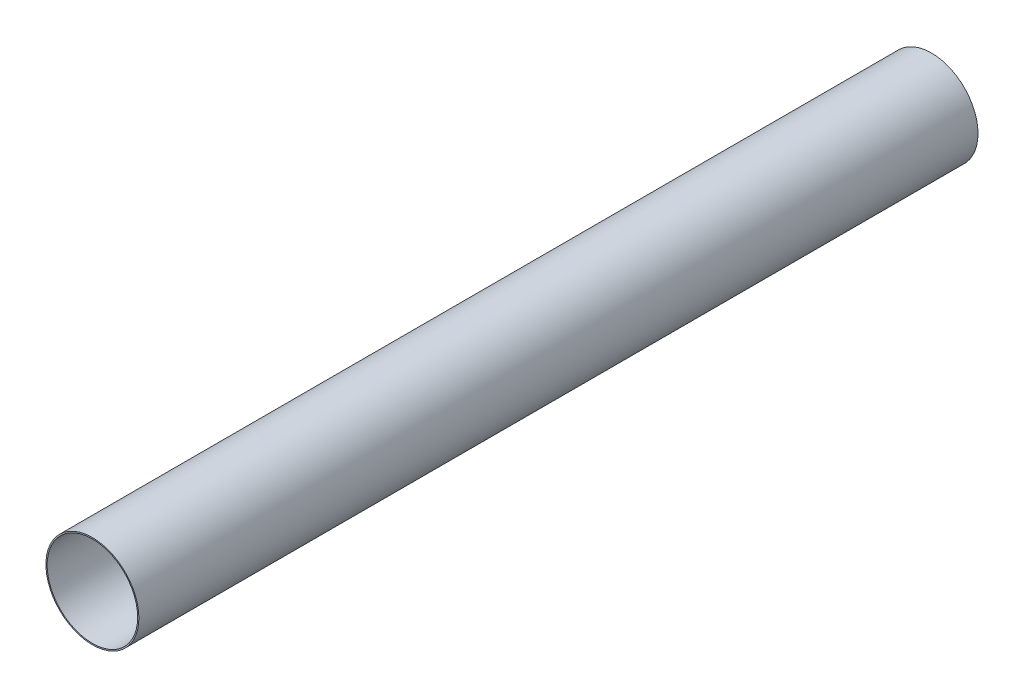
ISO-10303-21;
HEADER;
FILE_DESCRIPTION(('STEP AP214'),'2;1');
FILE_NAME('part.step','',(''),(''),'','','');
FILE_SCHEMA(('AUTOMOTIVE_DESIGN { 1 0 10303 214 1 1 1 1 }'));
ENDSEC;
DATA;
#1=APPLICATION_CONTEXT('core data for automotive mechanical design processes');
#2=APPLICATION_PROTOCOL_DEFINITION('international standard','automotive_design',2000,#1);
#3=PRODUCT_CONTEXT('',#1,'mechanical');
#4=PRODUCT('Part','Part','',(#3));
#5=PRODUCT_RELATED_PRODUCT_CATEGORY('part','',(#4));
#6=PRODUCT_DEFINITION_FORMATION('','',#4);
#7=PRODUCT_DEFINITION_CONTEXT('part definition',#1,'design');
#8=PRODUCT_DEFINITION('design','',#6,#7);
#9=PRODUCT_DEFINITION_SHAPE('','',#8);
#10=(LENGTH_UNIT() NAMED_UNIT(*) SI_UNIT(.MILLI.,.METRE.));
#11=(NAMED_UNIT(*) PLANE_ANGLE_UNIT() SI_UNIT($,.RADIAN.));
#12=(NAMED_UNIT(*) SI_UNIT($,.STERADIAN.) SOLID_ANGLE_UNIT());
#13=UNCERTAINTY_MEASURE_WITH_UNIT(LENGTH_MEASURE(1.E-05),#10,'distance_accuracy_value','');
#14=(GEOMETRIC_REPRESENTATION_CONTEXT(3) GLOBAL_UNCERTAINTY_ASSIGNED_CONTEXT((#13)) GLOBAL_UNIT_ASSIGNED_CONTEXT((#10,
#11,#12)) REPRESENTATION_CONTEXT('',''));
#15=CARTESIAN_POINT('',(0.,0.,0.));
#16=DIRECTION('',(0.,0.,1.));
#17=DIRECTION('',(1.,0.,0.));
#18=AXIS2_PLACEMENT_3D('',#15,#16,#17);
#19=CARTESIAN_POINT('',(0.,0.,381.));
#20=DIRECTION('',(0.,0.,1.));
#21=DIRECTION('',(1.,0.,0.));
#22=AXIS2_PLACEMENT_3D('',#19,#20,#21);
#23=PLANE('',#22);
#24=CARTESIAN_POINT('',(0.,0.,381.));
#25=DIRECTION('',(0.,0.,1.));
#26=DIRECTION('',(1.,0.,0.));
#27=AXIS2_PLACEMENT_3D('',#24,#25,#26);
#28=CIRCLE('',#27,21.1074);
#29=CARTESIAN_POINT('',(21.1074,0.,381.));
#30=VERTEX_POINT('',#29);
#31=EDGE_CURVE('E10',#30,#30,#28,.T.);
#32=ORIENTED_EDGE('',*,*,#31,.T.);
#33=EDGE_LOOP('',(#32));
#34=FACE_BOUND('',#33,.T.);
#35=CARTESIAN_POINT('',(0.,0.,381.));
#36=DIRECTION('',(0.,0.,1.));
#37=DIRECTION('',(1.,0.,0.));
#38=AXIS2_PLACEMENT_3D('',#35,#36,#37);
#39=CIRCLE('',#38,20.5486);
#40=CARTESIAN_POINT('',(20.5486,0.,381.));
#41=VERTEX_POINT('',#40);
#42=EDGE_CURVE('E45',#41,#41,#39,.T.);
#43=ORIENTED_EDGE('',*,*,#42,.F.);
#44=EDGE_LOOP('',(#43));
#45=FACE_BOUND('',#44,.T.);
#46=ADVANCED_FACE('F33',(#34,#45),#23,.T.);
#47=CARTESIAN_POINT('',(0.,0.,0.));
#48=DIRECTION('',(0.,0.,1.));
#49=DIRECTION('',(1.,0.,0.));
#50=AXIS2_PLACEMENT_3D('',#47,#48,#49);
#51=PLANE('',#50);
#52=CARTESIAN_POINT('',(0.,0.,0.));
#53=DIRECTION('',(0.,0.,1.));
#54=DIRECTION('',(1.,0.,0.));
#55=AXIS2_PLACEMENT_3D('',#52,#53,#54);
#56=CIRCLE('',#55,21.1074);
#57=CARTESIAN_POINT('',(21.1074,0.,0.));
#58=VERTEX_POINT('',#57);
#59=EDGE_CURVE('E37',#58,#58,#56,.T.);
#60=ORIENTED_EDGE('',*,*,#59,.F.);
#61=EDGE_LOOP('',(#60));
#62=FACE_BOUND('',#61,.T.);
#63=CARTESIAN_POINT('',(0.,0.,0.));
#64=DIRECTION('',(0.,0.,1.));
#65=DIRECTION('',(1.,0.,0.));
#66=AXIS2_PLACEMENT_3D('',#63,#64,#65);
#67=CIRCLE('',#66,20.5486);
#68=CARTESIAN_POINT('',(20.5486,0.,0.));
#69=VERTEX_POINT('',#68);
#70=EDGE_CURVE('E47',#69,#69,#67,.T.);
#71=ORIENTED_EDGE('',*,*,#70,.T.);
#72=EDGE_LOOP('',(#71));
#73=FACE_BOUND('',#72,.T.);
#74=ADVANCED_FACE('F58',(#62,#73),#51,.F.);
#75=CARTESIAN_POINT('',(0.,0.,381.));
#76=DIRECTION('',(0.,0.,-1.));
#77=DIRECTION('',(-1.,0.,0.));
#78=AXIS2_PLACEMENT_3D('',#75,#76,#77);
#79=CYLINDRICAL_SURFACE('',#78,21.1074);
#80=ORIENTED_EDGE('',*,*,#31,.F.);
#81=EDGE_LOOP('',(#80));
#82=FACE_BOUND('',#81,.T.);
#83=ORIENTED_EDGE('',*,*,#59,.T.);
#84=EDGE_LOOP('',(#83));
#85=FACE_BOUND('',#84,.T.);
#86=ADVANCED_FACE('F35',(#82,#85),#79,.T.);
#87=CARTESIAN_POINT('',(0.,0.,381.));
#88=DIRECTION('',(0.,0.,-1.));
#89=DIRECTION('',(-1.,0.,0.));
#90=AXIS2_PLACEMENT_3D('',#87,#88,#89);
#91=CYLINDRICAL_SURFACE('',#90,20.5486);
#92=ORIENTED_EDGE('',*,*,#42,.T.);
#93=EDGE_LOOP('',(#92));
#94=FACE_BOUND('',#93,.T.);
#95=ORIENTED_EDGE('',*,*,#70,.F.);
#96=EDGE_LOOP('',(#95));
#97=FACE_BOUND('',#96,.T.);
#98=ADVANCED_FACE('F54',(#94,#97),#91,.F.);
#99=CLOSED_SHELL('',(#46,#74,#86,#98));
#100=MANIFOLD_SOLID_BREP('B2',#99);
#101=ADVANCED_BREP_SHAPE_REPRESENTATION('',(#18,#100),#14);
#102=SHAPE_DEFINITION_REPRESENTATION(#9,#101);
ENDSEC;
END-ISO-10303-21;
